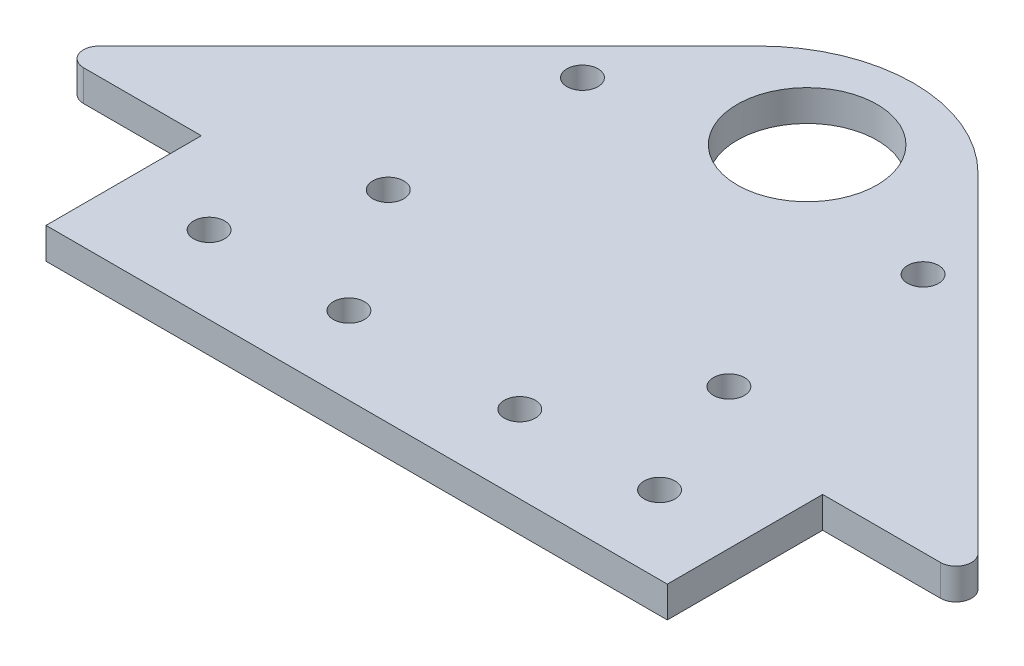
ISO-10303-21;
HEADER;
FILE_DESCRIPTION(('STEP AP214'),'2;1');
FILE_NAME('part.step','',(''),(''),'','','');
FILE_SCHEMA(('AUTOMOTIVE_DESIGN { 1 0 10303 214 1 1 1 1 }'));
ENDSEC;
DATA;
#1=APPLICATION_CONTEXT('core data for automotive mechanical design processes');
#2=APPLICATION_PROTOCOL_DEFINITION('international standard','automotive_design',2000,#1);
#3=PRODUCT_CONTEXT('',#1,'mechanical');
#4=PRODUCT('Part','Part','',(#3));
#5=PRODUCT_RELATED_PRODUCT_CATEGORY('part','',(#4));
#6=PRODUCT_DEFINITION_FORMATION('','',#4);
#7=PRODUCT_DEFINITION_CONTEXT('part definition',#1,'design');
#8=PRODUCT_DEFINITION('design','',#6,#7);
#9=PRODUCT_DEFINITION_SHAPE('','',#8);
#10=(LENGTH_UNIT() NAMED_UNIT(*) SI_UNIT(.MILLI.,.METRE.));
#11=(NAMED_UNIT(*) PLANE_ANGLE_UNIT() SI_UNIT($,.RADIAN.));
#12=(NAMED_UNIT(*) SI_UNIT($,.STERADIAN.) SOLID_ANGLE_UNIT());
#13=UNCERTAINTY_MEASURE_WITH_UNIT(LENGTH_MEASURE(1.E-05),#10,'distance_accuracy_value','');
#14=(GEOMETRIC_REPRESENTATION_CONTEXT(3) GLOBAL_UNCERTAINTY_ASSIGNED_CONTEXT((#13)) GLOBAL_UNIT_ASSIGNED_CONTEXT((#10,
#11,#12)) REPRESENTATION_CONTEXT('',''));
#15=CARTESIAN_POINT('',(0.,0.,0.));
#16=DIRECTION('',(0.,0.,1.));
#17=DIRECTION('',(1.,0.,0.));
#18=AXIS2_PLACEMENT_3D('',#15,#16,#17);
#19=CARTESIAN_POINT('',(0.,1.,0.));
#20=DIRECTION('',(0.,-1.,0.));
#21=DIRECTION('',(0.,0.,-1.));
#22=AXIS2_PLACEMENT_3D('',#19,#20,#21);
#23=PLANE('',#22);
#24=DIRECTION('',(-0.707106781186547,0.,0.707106781186547));
#25=VECTOR('',#24,1.);
#26=CARTESIAN_POINT('',(-15.,1.,0.));
#27=LINE('',#26,#25);
#28=CARTESIAN_POINT('',(-3.53553390593274,1.,-11.4644660940673));
#29=VERTEX_POINT('',#28);
#30=CARTESIAN_POINT('',(-14.1464466094067,1.,-0.85355339059327));
#31=VERTEX_POINT('',#30);
#32=EDGE_CURVE('E218',#29,#31,#27,.T.);
#33=ORIENTED_EDGE('',*,*,#32,.T.);
#34=CARTESIAN_POINT('',(-13.7928932188135,1.,-0.499999999999996));
#35=DIRECTION('',(0.,-1.,0.));
#36=DIRECTION('',(0.,0.,-1.));
#37=AXIS2_PLACEMENT_3D('',#34,#35,#36);
#38=CIRCLE('',#37,0.5);
#39=CARTESIAN_POINT('',(-13.7928932188135,1.,0.));
#40=VERTEX_POINT('',#39);
#41=EDGE_CURVE('E130',#31,#40,#38,.F.);
#42=ORIENTED_EDGE('',*,*,#41,.T.);
#43=DIRECTION('',(1.,0.,0.));
#44=VECTOR('',#43,1.);
#45=CARTESIAN_POINT('',(-15.,1.,0.));
#46=LINE('',#45,#44);
#47=CARTESIAN_POINT('',(-10.,1.,0.));
#48=VERTEX_POINT('',#47);
#49=EDGE_CURVE('E123',#40,#48,#46,.T.);
#50=ORIENTED_EDGE('',*,*,#49,.T.);
#51=DIRECTION('',(0.,0.,1.));
#52=VECTOR('',#51,1.);
#53=CARTESIAN_POINT('',(-10.,1.,0.));
#54=LINE('',#53,#52);
#55=CARTESIAN_POINT('',(-10.,1.,5.00000000000001));
#56=VERTEX_POINT('',#55);
#57=EDGE_CURVE('E127',#48,#56,#54,.T.);
#58=ORIENTED_EDGE('',*,*,#57,.T.);
#59=DIRECTION('',(1.,0.,0.));
#60=VECTOR('',#59,1.);
#61=CARTESIAN_POINT('',(-10.,1.,5.00000000000001));
#62=LINE('',#61,#60);
#63=CARTESIAN_POINT('',(10.,1.,5.00000000000001));
#64=VERTEX_POINT('',#63);
#65=EDGE_CURVE('E146',#56,#64,#62,.T.);
#66=ORIENTED_EDGE('',*,*,#65,.T.);
#67=DIRECTION('',(0.,0.,-1.));
#68=VECTOR('',#67,1.);
#69=CARTESIAN_POINT('',(10.,1.,0.));
#70=LINE('',#69,#68);
#71=CARTESIAN_POINT('',(10.,1.,0.));
#72=VERTEX_POINT('',#71);
#73=EDGE_CURVE('E227',#64,#72,#70,.T.);
#74=ORIENTED_EDGE('',*,*,#73,.T.);
#75=DIRECTION('',(1.,0.,0.));
#76=VECTOR('',#75,1.);
#77=CARTESIAN_POINT('',(10.,1.,0.));
#78=LINE('',#77,#76);
#79=CARTESIAN_POINT('',(13.7928932188135,1.,0.));
#80=VERTEX_POINT('',#79);
#81=EDGE_CURVE('E245',#72,#80,#78,.T.);
#82=ORIENTED_EDGE('',*,*,#81,.T.);
#83=CARTESIAN_POINT('',(13.7928932188135,1.,-0.499999999999996));
#84=DIRECTION('',(0.,-1.,0.));
#85=DIRECTION('',(0.,0.,-1.));
#86=AXIS2_PLACEMENT_3D('',#83,#84,#85);
#87=CIRCLE('',#86,0.5);
#88=CARTESIAN_POINT('',(14.1464466094067,1.,-0.85355339059327));
#89=VERTEX_POINT('',#88);
#90=EDGE_CURVE('E68',#80,#89,#87,.F.);
#91=ORIENTED_EDGE('',*,*,#90,.T.);
#92=DIRECTION('',(-0.707106781186547,0.,-0.707106781186547));
#93=VECTOR('',#92,1.);
#94=CARTESIAN_POINT('',(15.,1.,0.));
#95=LINE('',#94,#93);
#96=CARTESIAN_POINT('',(3.53553390593274,1.,-11.4644660940673));
#97=VERTEX_POINT('',#96);
#98=EDGE_CURVE('E196',#89,#97,#95,.T.);
#99=ORIENTED_EDGE('',*,*,#98,.T.);
#100=CARTESIAN_POINT('',(0.,1.,-7.92893218813452));
#101=DIRECTION('',(0.,-1.,0.));
#102=DIRECTION('',(0.,0.,-1.));
#103=AXIS2_PLACEMENT_3D('',#100,#101,#102);
#104=CIRCLE('',#103,5.);
#105=EDGE_CURVE('E171',#97,#29,#104,.F.);
#106=ORIENTED_EDGE('',*,*,#105,.T.);
#107=EDGE_LOOP('',(#33,#42,#50,#58,#66,#74,#82,#91,#99,#106));
#108=FACE_BOUND('',#107,.T.);
#109=CARTESIAN_POINT('',(0.,1.,-9.5));
#110=DIRECTION('',(0.,1.,0.));
#111=DIRECTION('',(0.,0.,1.));
#112=AXIS2_PLACEMENT_3D('',#109,#110,#111);
#113=CIRCLE('',#112,2.25);
#114=CARTESIAN_POINT('',(0.,1.,-7.25));
#115=VERTEX_POINT('',#114);
#116=EDGE_CURVE('E240',#115,#115,#113,.T.);
#117=ORIENTED_EDGE('',*,*,#116,.F.);
#118=EDGE_LOOP('',(#117));
#119=FACE_BOUND('',#118,.T.);
#120=CARTESIAN_POINT('',(5.48223304703364,1.,-7.75));
#121=DIRECTION('',(0.,1.,0.));
#122=DIRECTION('',(0.,0.,-1.));
#123=AXIS2_PLACEMENT_3D('',#120,#121,#122);
#124=CIRCLE('',#123,0.500000000000001);
#125=CARTESIAN_POINT('',(5.48223304703364,1.,-8.25));
#126=VERTEX_POINT('',#125);
#127=EDGE_CURVE('E256',#126,#126,#124,.T.);
#128=ORIENTED_EDGE('',*,*,#127,.F.);
#129=EDGE_LOOP('',(#128));
#130=FACE_BOUND('',#129,.T.);
#131=CARTESIAN_POINT('',(-5.48223304703364,1.,-7.75));
#132=DIRECTION('',(0.,1.,0.));
#133=DIRECTION('',(0.,0.,1.));
#134=AXIS2_PLACEMENT_3D('',#131,#132,#133);
#135=CIRCLE('',#134,0.500000000000001);
#136=CARTESIAN_POINT('',(-5.48223304703364,1.,-7.25));
#137=VERTEX_POINT('',#136);
#138=EDGE_CURVE('E264',#137,#137,#135,.T.);
#139=ORIENTED_EDGE('',*,*,#138,.F.);
#140=EDGE_LOOP('',(#139));
#141=FACE_BOUND('',#140,.T.);
#142=CARTESIAN_POINT('',(-5.48223304703364,1.,-1.5));
#143=DIRECTION('',(0.,1.,0.));
#144=DIRECTION('',(0.,0.,1.));
#145=AXIS2_PLACEMENT_3D('',#142,#143,#144);
#146=CIRCLE('',#145,0.5);
#147=CARTESIAN_POINT('',(-5.48223304703364,1.,-0.999999999999997));
#148=VERTEX_POINT('',#147);
#149=EDGE_CURVE('E272',#148,#148,#146,.T.);
#150=ORIENTED_EDGE('',*,*,#149,.F.);
#151=EDGE_LOOP('',(#150));
#152=FACE_BOUND('',#151,.T.);
#153=CARTESIAN_POINT('',(5.48223304703364,1.,-1.5));
#154=DIRECTION('',(0.,1.,0.));
#155=DIRECTION('',(0.,0.,-1.));
#156=AXIS2_PLACEMENT_3D('',#153,#154,#155);
#157=CIRCLE('',#156,0.5);
#158=CARTESIAN_POINT('',(5.48223304703364,1.,-2.));
#159=VERTEX_POINT('',#158);
#160=EDGE_CURVE('E280',#159,#159,#157,.T.);
#161=ORIENTED_EDGE('',*,*,#160,.F.);
#162=EDGE_LOOP('',(#161));
#163=FACE_BOUND('',#162,.T.);
#164=CARTESIAN_POINT('',(-7.25,1.,2.50000000000001));
#165=DIRECTION('',(0.,1.,0.));
#166=DIRECTION('',(0.,0.,1.));
#167=AXIS2_PLACEMENT_3D('',#164,#165,#166);
#168=CIRCLE('',#167,0.500000000000001);
#169=CARTESIAN_POINT('',(-7.25,1.,3.00000000000001));
#170=VERTEX_POINT('',#169);
#171=EDGE_CURVE('E288',#170,#170,#168,.T.);
#172=ORIENTED_EDGE('',*,*,#171,.F.);
#173=EDGE_LOOP('',(#172));
#174=FACE_BOUND('',#173,.T.);
#175=CARTESIAN_POINT('',(-2.75,1.,2.50000000000001));
#176=DIRECTION('',(0.,1.,0.));
#177=DIRECTION('',(0.,0.,1.));
#178=AXIS2_PLACEMENT_3D('',#175,#176,#177);
#179=CIRCLE('',#178,0.5);
#180=CARTESIAN_POINT('',(-2.75,1.,3.00000000000001));
#181=VERTEX_POINT('',#180);
#182=EDGE_CURVE('E296',#181,#181,#179,.T.);
#183=ORIENTED_EDGE('',*,*,#182,.F.);
#184=EDGE_LOOP('',(#183));
#185=FACE_BOUND('',#184,.T.);
#186=CARTESIAN_POINT('',(2.75,1.,2.50000000000001));
#187=DIRECTION('',(0.,1.,0.));
#188=DIRECTION('',(0.,0.,-1.));
#189=AXIS2_PLACEMENT_3D('',#186,#187,#188);
#190=CIRCLE('',#189,0.5);
#191=CARTESIAN_POINT('',(2.75,1.,2.00000000000001));
#192=VERTEX_POINT('',#191);
#193=EDGE_CURVE('E304',#192,#192,#190,.T.);
#194=ORIENTED_EDGE('',*,*,#193,.F.);
#195=EDGE_LOOP('',(#194));
#196=FACE_BOUND('',#195,.T.);
#197=CARTESIAN_POINT('',(7.25,1.,2.50000000000001));
#198=DIRECTION('',(0.,1.,0.));
#199=DIRECTION('',(0.,0.,-1.));
#200=AXIS2_PLACEMENT_3D('',#197,#198,#199);
#201=CIRCLE('',#200,0.500000000000001);
#202=CARTESIAN_POINT('',(7.25,1.,2.00000000000001));
#203=VERTEX_POINT('',#202);
#204=EDGE_CURVE('E312',#203,#203,#201,.T.);
#205=ORIENTED_EDGE('',*,*,#204,.F.);
#206=EDGE_LOOP('',(#205));
#207=FACE_BOUND('',#206,.T.);
#208=ADVANCED_FACE('F47',(#108,#119,#130,#141,#152,#163,#174,#185,#196,#207),#23,.F.);
#209=CARTESIAN_POINT('',(0.,0.,0.));
#210=DIRECTION('',(0.,-1.,0.));
#211=DIRECTION('',(0.,0.,-1.));
#212=AXIS2_PLACEMENT_3D('',#209,#210,#211);
#213=PLANE('',#212);
#214=CARTESIAN_POINT('',(2.75,0.,2.50000000000001));
#215=DIRECTION('',(0.,1.,0.));
#216=DIRECTION('',(0.,0.,-1.));
#217=AXIS2_PLACEMENT_3D('',#214,#215,#216);
#218=CIRCLE('',#217,0.5);
#219=CARTESIAN_POINT('',(2.75,0.,2.00000000000001));
#220=VERTEX_POINT('',#219);
#221=EDGE_CURVE('E308',#220,#220,#218,.T.);
#222=ORIENTED_EDGE('',*,*,#221,.T.);
#223=EDGE_LOOP('',(#222));
#224=FACE_BOUND('',#223,.T.);
#225=CARTESIAN_POINT('',(-7.25,0.,2.50000000000001));
#226=DIRECTION('',(0.,1.,0.));
#227=DIRECTION('',(0.,0.,1.));
#228=AXIS2_PLACEMENT_3D('',#225,#226,#227);
#229=CIRCLE('',#228,0.500000000000001);
#230=CARTESIAN_POINT('',(-7.25,0.,3.00000000000001));
#231=VERTEX_POINT('',#230);
#232=EDGE_CURVE('E292',#231,#231,#229,.T.);
#233=ORIENTED_EDGE('',*,*,#232,.T.);
#234=EDGE_LOOP('',(#233));
#235=FACE_BOUND('',#234,.T.);
#236=CARTESIAN_POINT('',(-5.48223304703364,0.,-1.5));
#237=DIRECTION('',(0.,1.,0.));
#238=DIRECTION('',(0.,0.,1.));
#239=AXIS2_PLACEMENT_3D('',#236,#237,#238);
#240=CIRCLE('',#239,0.5);
#241=CARTESIAN_POINT('',(-5.48223304703364,0.,-0.999999999999997));
#242=VERTEX_POINT('',#241);
#243=EDGE_CURVE('E276',#242,#242,#240,.T.);
#244=ORIENTED_EDGE('',*,*,#243,.T.);
#245=EDGE_LOOP('',(#244));
#246=FACE_BOUND('',#245,.T.);
#247=CARTESIAN_POINT('',(5.48223304703364,0.,-7.75));
#248=DIRECTION('',(0.,1.,0.));
#249=DIRECTION('',(0.,0.,-1.));
#250=AXIS2_PLACEMENT_3D('',#247,#248,#249);
#251=CIRCLE('',#250,0.500000000000001);
#252=CARTESIAN_POINT('',(5.48223304703364,0.,-8.25));
#253=VERTEX_POINT('',#252);
#254=EDGE_CURVE('E260',#253,#253,#251,.T.);
#255=ORIENTED_EDGE('',*,*,#254,.T.);
#256=EDGE_LOOP('',(#255));
#257=FACE_BOUND('',#256,.T.);
#258=DIRECTION('',(1.,0.,0.));
#259=VECTOR('',#258,1.);
#260=CARTESIAN_POINT('',(-15.,0.,0.));
#261=LINE('',#260,#259);
#262=CARTESIAN_POINT('',(-13.7928932188135,0.,0.));
#263=VERTEX_POINT('',#262);
#264=CARTESIAN_POINT('',(-10.,0.,0.));
#265=VERTEX_POINT('',#264);
#266=EDGE_CURVE('E150',#263,#265,#261,.T.);
#267=ORIENTED_EDGE('',*,*,#266,.F.);
#268=CARTESIAN_POINT('',(-13.7928932188135,0.,-0.499999999999996));
#269=DIRECTION('',(0.,-1.,0.));
#270=DIRECTION('',(0.,0.,-1.));
#271=AXIS2_PLACEMENT_3D('',#268,#269,#270);
#272=CIRCLE('',#271,0.5);
#273=CARTESIAN_POINT('',(-14.1464466094067,0.,-0.85355339059327));
#274=VERTEX_POINT('',#273);
#275=EDGE_CURVE('E180',#263,#274,#272,.T.);
#276=ORIENTED_EDGE('',*,*,#275,.T.);
#277=DIRECTION('',(-0.707106781186547,0.,0.707106781186547));
#278=VECTOR('',#277,1.);
#279=CARTESIAN_POINT('',(-15.,0.,0.));
#280=LINE('',#279,#278);
#281=CARTESIAN_POINT('',(-3.53553390593274,0.,-11.4644660940673));
#282=VERTEX_POINT('',#281);
#283=EDGE_CURVE('E136',#282,#274,#280,.T.);
#284=ORIENTED_EDGE('',*,*,#283,.F.);
#285=CARTESIAN_POINT('',(0.,0.,-7.92893218813452));
#286=DIRECTION('',(0.,-1.,0.));
#287=DIRECTION('',(0.,0.,-1.));
#288=AXIS2_PLACEMENT_3D('',#285,#286,#287);
#289=CIRCLE('',#288,5.);
#290=CARTESIAN_POINT('',(3.53553390593274,0.,-11.4644660940673));
#291=VERTEX_POINT('',#290);
#292=EDGE_CURVE('E158',#282,#291,#289,.T.);
#293=ORIENTED_EDGE('',*,*,#292,.T.);
#294=DIRECTION('',(-0.707106781186547,0.,-0.707106781186547));
#295=VECTOR('',#294,1.);
#296=CARTESIAN_POINT('',(15.,0.,0.));
#297=LINE('',#296,#295);
#298=CARTESIAN_POINT('',(14.1464466094067,0.,-0.85355339059327));
#299=VERTEX_POINT('',#298);
#300=EDGE_CURVE('E195',#299,#291,#297,.T.);
#301=ORIENTED_EDGE('',*,*,#300,.F.);
#302=CARTESIAN_POINT('',(13.7928932188135,0.,-0.499999999999996));
#303=DIRECTION('',(0.,-1.,0.));
#304=DIRECTION('',(0.,0.,-1.));
#305=AXIS2_PLACEMENT_3D('',#302,#303,#304);
#306=CIRCLE('',#305,0.5);
#307=CARTESIAN_POINT('',(13.7928932188135,0.,0.));
#308=VERTEX_POINT('',#307);
#309=EDGE_CURVE('E177',#299,#308,#306,.T.);
#310=ORIENTED_EDGE('',*,*,#309,.T.);
#311=DIRECTION('',(1.,0.,0.));
#312=VECTOR('',#311,1.);
#313=CARTESIAN_POINT('',(10.,0.,0.));
#314=LINE('',#313,#312);
#315=CARTESIAN_POINT('',(10.,0.,0.));
#316=VERTEX_POINT('',#315);
#317=EDGE_CURVE('E205',#316,#308,#314,.T.);
#318=ORIENTED_EDGE('',*,*,#317,.F.);
#319=DIRECTION('',(0.,0.,-1.));
#320=VECTOR('',#319,1.);
#321=CARTESIAN_POINT('',(10.,0.,0.));
#322=LINE('',#321,#320);
#323=CARTESIAN_POINT('',(10.,0.,5.00000000000001));
#324=VERTEX_POINT('',#323);
#325=EDGE_CURVE('E211',#324,#316,#322,.T.);
#326=ORIENTED_EDGE('',*,*,#325,.F.);
#327=DIRECTION('',(1.,0.,0.));
#328=VECTOR('',#327,1.);
#329=CARTESIAN_POINT('',(-10.,0.,5.00000000000001));
#330=LINE('',#329,#328);
#331=CARTESIAN_POINT('',(-10.,0.,5.00000000000001));
#332=VERTEX_POINT('',#331);
#333=EDGE_CURVE('E230',#332,#324,#330,.T.);
#334=ORIENTED_EDGE('',*,*,#333,.F.);
#335=DIRECTION('',(0.,0.,1.));
#336=VECTOR('',#335,1.);
#337=CARTESIAN_POINT('',(-10.,0.,0.));
#338=LINE('',#337,#336);
#339=EDGE_CURVE('E233',#265,#332,#338,.T.);
#340=ORIENTED_EDGE('',*,*,#339,.F.);
#341=EDGE_LOOP('',(#267,#276,#284,#293,#301,#310,#318,#326,#334,#340));
#342=FACE_BOUND('',#341,.T.);
#343=CARTESIAN_POINT('',(0.,0.,-9.5));
#344=DIRECTION('',(0.,1.,0.));
#345=DIRECTION('',(0.,0.,1.));
#346=AXIS2_PLACEMENT_3D('',#343,#344,#345);
#347=CIRCLE('',#346,2.25);
#348=CARTESIAN_POINT('',(0.,0.,-7.25));
#349=VERTEX_POINT('',#348);
#350=EDGE_CURVE('E252',#349,#349,#347,.T.);
#351=ORIENTED_EDGE('',*,*,#350,.T.);
#352=EDGE_LOOP('',(#351));
#353=FACE_BOUND('',#352,.T.);
#354=CARTESIAN_POINT('',(-5.48223304703364,0.,-7.75));
#355=DIRECTION('',(0.,1.,0.));
#356=DIRECTION('',(0.,0.,1.));
#357=AXIS2_PLACEMENT_3D('',#354,#355,#356);
#358=CIRCLE('',#357,0.500000000000001);
#359=CARTESIAN_POINT('',(-5.48223304703364,0.,-7.25));
#360=VERTEX_POINT('',#359);
#361=EDGE_CURVE('E268',#360,#360,#358,.T.);
#362=ORIENTED_EDGE('',*,*,#361,.T.);
#363=EDGE_LOOP('',(#362));
#364=FACE_BOUND('',#363,.T.);
#365=CARTESIAN_POINT('',(5.48223304703364,0.,-1.5));
#366=DIRECTION('',(0.,1.,0.));
#367=DIRECTION('',(0.,0.,-1.));
#368=AXIS2_PLACEMENT_3D('',#365,#366,#367);
#369=CIRCLE('',#368,0.5);
#370=CARTESIAN_POINT('',(5.48223304703364,0.,-2.));
#371=VERTEX_POINT('',#370);
#372=EDGE_CURVE('E284',#371,#371,#369,.T.);
#373=ORIENTED_EDGE('',*,*,#372,.T.);
#374=EDGE_LOOP('',(#373));
#375=FACE_BOUND('',#374,.T.);
#376=CARTESIAN_POINT('',(-2.75,0.,2.50000000000001));
#377=DIRECTION('',(0.,1.,0.));
#378=DIRECTION('',(0.,0.,1.));
#379=AXIS2_PLACEMENT_3D('',#376,#377,#378);
#380=CIRCLE('',#379,0.5);
#381=CARTESIAN_POINT('',(-2.75,0.,3.00000000000001));
#382=VERTEX_POINT('',#381);
#383=EDGE_CURVE('E300',#382,#382,#380,.T.);
#384=ORIENTED_EDGE('',*,*,#383,.T.);
#385=EDGE_LOOP('',(#384));
#386=FACE_BOUND('',#385,.T.);
#387=CARTESIAN_POINT('',(7.25,0.,2.50000000000001));
#388=DIRECTION('',(0.,1.,0.));
#389=DIRECTION('',(0.,0.,-1.));
#390=AXIS2_PLACEMENT_3D('',#387,#388,#389);
#391=CIRCLE('',#390,0.500000000000001);
#392=CARTESIAN_POINT('',(7.25,0.,2.00000000000001));
#393=VERTEX_POINT('',#392);
#394=EDGE_CURVE('E316',#393,#393,#391,.T.);
#395=ORIENTED_EDGE('',*,*,#394,.T.);
#396=EDGE_LOOP('',(#395));
#397=FACE_BOUND('',#396,.T.);
#398=ADVANCED_FACE('F199',(#224,#235,#246,#257,#342,#353,#364,#375,#386,#397),#213,.T.);
#399=CARTESIAN_POINT('',(-15.,1.,0.));
#400=DIRECTION('',(0.,0.,-1.));
#401=DIRECTION('',(-1.,0.,0.));
#402=AXIS2_PLACEMENT_3D('',#399,#400,#401);
#403=PLANE('',#402);
#404=ORIENTED_EDGE('',*,*,#49,.F.);
#405=DIRECTION('',(0.,-1.,0.));
#406=VECTOR('',#405,1.);
#407=CARTESIAN_POINT('',(-13.7928932188135,1.,0.));
#408=LINE('',#407,#406);
#409=EDGE_CURVE('E174',#40,#263,#408,.T.);
#410=ORIENTED_EDGE('',*,*,#409,.T.);
#411=ORIENTED_EDGE('',*,*,#266,.T.);
#412=DIRECTION('',(0.,-1.,0.));
#413=VECTOR('',#412,1.);
#414=CARTESIAN_POINT('',(-10.,1.,0.));
#415=LINE('',#414,#413);
#416=EDGE_CURVE('E141',#48,#265,#415,.T.);
#417=ORIENTED_EDGE('',*,*,#416,.F.);
#418=EDGE_LOOP('',(#404,#410,#411,#417));
#419=FACE_BOUND('',#418,.T.);
#420=ADVANCED_FACE('F148',(#419),#403,.F.);
#421=CARTESIAN_POINT('',(-10.,1.,0.));
#422=DIRECTION('',(1.,0.,0.));
#423=DIRECTION('',(0.,0.,-1.));
#424=AXIS2_PLACEMENT_3D('',#421,#422,#423);
#425=PLANE('',#424);
#426=ORIENTED_EDGE('',*,*,#339,.T.);
#427=DIRECTION('',(0.,-1.,0.));
#428=VECTOR('',#427,1.);
#429=CARTESIAN_POINT('',(-10.,1.,5.00000000000001));
#430=LINE('',#429,#428);
#431=EDGE_CURVE('E143',#56,#332,#430,.T.);
#432=ORIENTED_EDGE('',*,*,#431,.F.);
#433=ORIENTED_EDGE('',*,*,#57,.F.);
#434=ORIENTED_EDGE('',*,*,#416,.T.);
#435=EDGE_LOOP('',(#426,#432,#433,#434));
#436=FACE_BOUND('',#435,.T.);
#437=ADVANCED_FACE('F140',(#436),#425,.F.);
#438=CARTESIAN_POINT('',(-10.,1.,5.00000000000001));
#439=DIRECTION('',(0.,0.,-1.));
#440=DIRECTION('',(-1.,0.,0.));
#441=AXIS2_PLACEMENT_3D('',#438,#439,#440);
#442=PLANE('',#441);
#443=ORIENTED_EDGE('',*,*,#333,.T.);
#444=DIRECTION('',(0.,-1.,0.));
#445=VECTOR('',#444,1.);
#446=CARTESIAN_POINT('',(10.,1.,5.00000000000001));
#447=LINE('',#446,#445);
#448=EDGE_CURVE('E160',#64,#324,#447,.T.);
#449=ORIENTED_EDGE('',*,*,#448,.F.);
#450=ORIENTED_EDGE('',*,*,#65,.F.);
#451=ORIENTED_EDGE('',*,*,#431,.T.);
#452=EDGE_LOOP('',(#443,#449,#450,#451));
#453=FACE_BOUND('',#452,.T.);
#454=ADVANCED_FACE('F350',(#453),#442,.F.);
#455=CARTESIAN_POINT('',(10.,1.,0.));
#456=DIRECTION('',(-1.,0.,0.));
#457=DIRECTION('',(0.,0.,1.));
#458=AXIS2_PLACEMENT_3D('',#455,#456,#457);
#459=PLANE('',#458);
#460=ORIENTED_EDGE('',*,*,#325,.T.);
#461=DIRECTION('',(0.,-1.,0.));
#462=VECTOR('',#461,1.);
#463=CARTESIAN_POINT('',(10.,1.,0.));
#464=LINE('',#463,#462);
#465=EDGE_CURVE('E215',#72,#316,#464,.T.);
#466=ORIENTED_EDGE('',*,*,#465,.F.);
#467=ORIENTED_EDGE('',*,*,#73,.F.);
#468=ORIENTED_EDGE('',*,*,#448,.T.);
#469=EDGE_LOOP('',(#460,#466,#467,#468));
#470=FACE_BOUND('',#469,.T.);
#471=ADVANCED_FACE('F225',(#470),#459,.F.);
#472=CARTESIAN_POINT('',(10.,1.,0.));
#473=DIRECTION('',(0.,0.,-1.));
#474=DIRECTION('',(-1.,0.,0.));
#475=AXIS2_PLACEMENT_3D('',#472,#473,#474);
#476=PLANE('',#475);
#477=ORIENTED_EDGE('',*,*,#317,.T.);
#478=DIRECTION('',(0.,-1.,0.));
#479=VECTOR('',#478,1.);
#480=CARTESIAN_POINT('',(13.7928932188135,1.,0.));
#481=LINE('',#480,#479);
#482=EDGE_CURVE('E11',#308,#80,#481,.F.);
#483=ORIENTED_EDGE('',*,*,#482,.T.);
#484=ORIENTED_EDGE('',*,*,#81,.F.);
#485=ORIENTED_EDGE('',*,*,#465,.T.);
#486=EDGE_LOOP('',(#477,#483,#484,#485));
#487=FACE_BOUND('',#486,.T.);
#488=ADVANCED_FACE('F345',(#487),#476,.F.);
#489=CARTESIAN_POINT('',(15.,1.,0.));
#490=DIRECTION('',(-0.707106781186547,0.,0.707106781186547));
#491=DIRECTION('',(0.707106781186548,0.,0.707106781186548));
#492=AXIS2_PLACEMENT_3D('',#489,#490,#491);
#493=PLANE('',#492);
#494=ORIENTED_EDGE('',*,*,#98,.F.);
#495=DIRECTION('',(0.,-1.,0.));
#496=VECTOR('',#495,1.);
#497=CARTESIAN_POINT('',(14.1464466094067,1.,-0.85355339059327));
#498=LINE('',#497,#496);
#499=EDGE_CURVE('E56',#89,#299,#498,.T.);
#500=ORIENTED_EDGE('',*,*,#499,.T.);
#501=ORIENTED_EDGE('',*,*,#300,.T.);
#502=DIRECTION('',(0.,-1.,0.));
#503=VECTOR('',#502,1.);
#504=CARTESIAN_POINT('',(3.53553390593274,1.,-11.4644660940673));
#505=LINE('',#504,#503);
#506=EDGE_CURVE('E167',#291,#97,#505,.F.);
#507=ORIENTED_EDGE('',*,*,#506,.T.);
#508=EDGE_LOOP('',(#494,#500,#501,#507));
#509=FACE_BOUND('',#508,.T.);
#510=ADVANCED_FACE('F194',(#509),#493,.F.);
#511=CARTESIAN_POINT('',(-15.,1.,0.));
#512=DIRECTION('',(0.707106781186547,0.,0.707106781186547));
#513=DIRECTION('',(0.707106781186548,0.,-0.707106781186548));
#514=AXIS2_PLACEMENT_3D('',#511,#512,#513);
#515=PLANE('',#514);
#516=ORIENTED_EDGE('',*,*,#283,.T.);
#517=DIRECTION('',(0.,-1.,0.));
#518=VECTOR('',#517,1.);
#519=CARTESIAN_POINT('',(-14.1464466094067,1.,-0.85355339059327));
#520=LINE('',#519,#518);
#521=EDGE_CURVE('E183',#274,#31,#520,.F.);
#522=ORIENTED_EDGE('',*,*,#521,.T.);
#523=ORIENTED_EDGE('',*,*,#32,.F.);
#524=DIRECTION('',(0.,-1.,0.));
#525=VECTOR('',#524,1.);
#526=CARTESIAN_POINT('',(-3.53553390593274,1.,-11.4644660940673));
#527=LINE('',#526,#525);
#528=EDGE_CURVE('E153',#29,#282,#527,.T.);
#529=ORIENTED_EDGE('',*,*,#528,.T.);
#530=EDGE_LOOP('',(#516,#522,#523,#529));
#531=FACE_BOUND('',#530,.T.);
#532=ADVANCED_FACE('F339',(#531),#515,.F.);
#533=CARTESIAN_POINT('',(0.,1.,-9.5));
#534=DIRECTION('',(0.,-1.,0.));
#535=DIRECTION('',(0.,0.,-1.));
#536=AXIS2_PLACEMENT_3D('',#533,#534,#535);
#537=CYLINDRICAL_SURFACE('',#536,2.25);
#538=ORIENTED_EDGE('',*,*,#116,.T.);
#539=EDGE_LOOP('',(#538));
#540=FACE_BOUND('',#539,.T.);
#541=ORIENTED_EDGE('',*,*,#350,.F.);
#542=EDGE_LOOP('',(#541));
#543=FACE_BOUND('',#542,.T.);
#544=ADVANCED_FACE('F336',(#540,#543),#537,.F.);
#545=CARTESIAN_POINT('',(5.48223304703364,1.,-7.75));
#546=DIRECTION('',(0.,-1.,0.));
#547=DIRECTION('',(0.,0.,-1.));
#548=AXIS2_PLACEMENT_3D('',#545,#546,#547);
#549=CYLINDRICAL_SURFACE('',#548,0.500000000000001);
#550=ORIENTED_EDGE('',*,*,#127,.T.);
#551=EDGE_LOOP('',(#550));
#552=FACE_BOUND('',#551,.T.);
#553=ORIENTED_EDGE('',*,*,#254,.F.);
#554=EDGE_LOOP('',(#553));
#555=FACE_BOUND('',#554,.T.);
#556=ADVANCED_FACE('F450',(#552,#555),#549,.F.);
#557=CARTESIAN_POINT('',(-5.48223304703364,1.,-7.75));
#558=DIRECTION('',(0.,-1.,0.));
#559=DIRECTION('',(0.,0.,-1.));
#560=AXIS2_PLACEMENT_3D('',#557,#558,#559);
#561=CYLINDRICAL_SURFACE('',#560,0.500000000000001);
#562=ORIENTED_EDGE('',*,*,#138,.T.);
#563=EDGE_LOOP('',(#562));
#564=FACE_BOUND('',#563,.T.);
#565=ORIENTED_EDGE('',*,*,#361,.F.);
#566=EDGE_LOOP('',(#565));
#567=FACE_BOUND('',#566,.T.);
#568=ADVANCED_FACE('F440',(#564,#567),#561,.F.);
#569=CARTESIAN_POINT('',(-5.48223304703364,1.,-1.5));
#570=DIRECTION('',(0.,-1.,0.));
#571=DIRECTION('',(0.,0.,-1.));
#572=AXIS2_PLACEMENT_3D('',#569,#570,#571);
#573=CYLINDRICAL_SURFACE('',#572,0.5);
#574=ORIENTED_EDGE('',*,*,#149,.T.);
#575=EDGE_LOOP('',(#574));
#576=FACE_BOUND('',#575,.T.);
#577=ORIENTED_EDGE('',*,*,#243,.F.);
#578=EDGE_LOOP('',(#577));
#579=FACE_BOUND('',#578,.T.);
#580=ADVANCED_FACE('F430',(#576,#579),#573,.F.);
#581=CARTESIAN_POINT('',(5.48223304703364,1.,-1.5));
#582=DIRECTION('',(0.,-1.,0.));
#583=DIRECTION('',(0.,0.,-1.));
#584=AXIS2_PLACEMENT_3D('',#581,#582,#583);
#585=CYLINDRICAL_SURFACE('',#584,0.5);
#586=ORIENTED_EDGE('',*,*,#160,.T.);
#587=EDGE_LOOP('',(#586));
#588=FACE_BOUND('',#587,.T.);
#589=ORIENTED_EDGE('',*,*,#372,.F.);
#590=EDGE_LOOP('',(#589));
#591=FACE_BOUND('',#590,.T.);
#592=ADVANCED_FACE('F420',(#588,#591),#585,.F.);
#593=CARTESIAN_POINT('',(-7.25,1.,2.50000000000001));
#594=DIRECTION('',(0.,-1.,0.));
#595=DIRECTION('',(0.,0.,-1.));
#596=AXIS2_PLACEMENT_3D('',#593,#594,#595);
#597=CYLINDRICAL_SURFACE('',#596,0.500000000000001);
#598=ORIENTED_EDGE('',*,*,#171,.T.);
#599=EDGE_LOOP('',(#598));
#600=FACE_BOUND('',#599,.T.);
#601=ORIENTED_EDGE('',*,*,#232,.F.);
#602=EDGE_LOOP('',(#601));
#603=FACE_BOUND('',#602,.T.);
#604=ADVANCED_FACE('F410',(#600,#603),#597,.F.);
#605=CARTESIAN_POINT('',(-2.75,1.,2.50000000000001));
#606=DIRECTION('',(0.,-1.,0.));
#607=DIRECTION('',(0.,0.,-1.));
#608=AXIS2_PLACEMENT_3D('',#605,#606,#607);
#609=CYLINDRICAL_SURFACE('',#608,0.5);
#610=ORIENTED_EDGE('',*,*,#182,.T.);
#611=EDGE_LOOP('',(#610));
#612=FACE_BOUND('',#611,.T.);
#613=ORIENTED_EDGE('',*,*,#383,.F.);
#614=EDGE_LOOP('',(#613));
#615=FACE_BOUND('',#614,.T.);
#616=ADVANCED_FACE('F400',(#612,#615),#609,.F.);
#617=CARTESIAN_POINT('',(2.75,1.,2.50000000000001));
#618=DIRECTION('',(0.,-1.,0.));
#619=DIRECTION('',(0.,0.,-1.));
#620=AXIS2_PLACEMENT_3D('',#617,#618,#619);
#621=CYLINDRICAL_SURFACE('',#620,0.5);
#622=ORIENTED_EDGE('',*,*,#193,.T.);
#623=EDGE_LOOP('',(#622));
#624=FACE_BOUND('',#623,.T.);
#625=ORIENTED_EDGE('',*,*,#221,.F.);
#626=EDGE_LOOP('',(#625));
#627=FACE_BOUND('',#626,.T.);
#628=ADVANCED_FACE('F391',(#624,#627),#621,.F.);
#629=CARTESIAN_POINT('',(7.25,1.,2.50000000000001));
#630=DIRECTION('',(0.,-1.,0.));
#631=DIRECTION('',(0.,0.,-1.));
#632=AXIS2_PLACEMENT_3D('',#629,#630,#631);
#633=CYLINDRICAL_SURFACE('',#632,0.500000000000001);
#634=ORIENTED_EDGE('',*,*,#204,.T.);
#635=EDGE_LOOP('',(#634));
#636=FACE_BOUND('',#635,.T.);
#637=ORIENTED_EDGE('',*,*,#394,.F.);
#638=EDGE_LOOP('',(#637));
#639=FACE_BOUND('',#638,.T.);
#640=ADVANCED_FACE('F324',(#636,#639),#633,.F.);
#641=CARTESIAN_POINT('',(0.,1.,-7.92893218813452));
#642=DIRECTION('',(0.,-1.,0.));
#643=DIRECTION('',(0.,0.,-1.));
#644=AXIS2_PLACEMENT_3D('',#641,#642,#643);
#645=CYLINDRICAL_SURFACE('',#644,5.);
#646=ORIENTED_EDGE('',*,*,#105,.F.);
#647=ORIENTED_EDGE('',*,*,#506,.F.);
#648=ORIENTED_EDGE('',*,*,#292,.F.);
#649=ORIENTED_EDGE('',*,*,#528,.F.);
#650=EDGE_LOOP('',(#646,#647,#648,#649));
#651=FACE_BOUND('',#650,.T.);
#652=ADVANCED_FACE('F357',(#651),#645,.T.);
#653=CARTESIAN_POINT('',(-13.7928932188135,1.,-0.499999999999996));
#654=DIRECTION('',(0.,-1.,0.));
#655=DIRECTION('',(0.,0.,-1.));
#656=AXIS2_PLACEMENT_3D('',#653,#654,#655);
#657=CYLINDRICAL_SURFACE('',#656,0.5);
#658=ORIENTED_EDGE('',*,*,#41,.F.);
#659=ORIENTED_EDGE('',*,*,#521,.F.);
#660=ORIENTED_EDGE('',*,*,#275,.F.);
#661=ORIENTED_EDGE('',*,*,#409,.F.);
#662=EDGE_LOOP('',(#658,#659,#660,#661));
#663=FACE_BOUND('',#662,.T.);
#664=ADVANCED_FACE('F358',(#663),#657,.T.);
#665=CARTESIAN_POINT('',(13.7928932188135,1.,-0.499999999999996));
#666=DIRECTION('',(0.,-1.,0.));
#667=DIRECTION('',(0.,0.,-1.));
#668=AXIS2_PLACEMENT_3D('',#665,#666,#667);
#669=CYLINDRICAL_SURFACE('',#668,0.5);
#670=ORIENTED_EDGE('',*,*,#90,.F.);
#671=ORIENTED_EDGE('',*,*,#482,.F.);
#672=ORIENTED_EDGE('',*,*,#309,.F.);
#673=ORIENTED_EDGE('',*,*,#499,.F.);
#674=EDGE_LOOP('',(#670,#671,#672,#673));
#675=FACE_BOUND('',#674,.T.);
#676=ADVANCED_FACE('F49',(#675),#669,.T.);
#677=CLOSED_SHELL('',(#208,#398,#420,#437,#454,#471,#488,#510,#532,#544,#556,#568,#580,#592,
#604,#616,#628,#640,#652,#664,#676));
#678=MANIFOLD_SOLID_BREP('B2',#677);
#679=ADVANCED_BREP_SHAPE_REPRESENTATION('',(#18,#678),#14);
#680=SHAPE_DEFINITION_REPRESENTATION(#9,#679);
ENDSEC;
END-ISO-10303-21;
